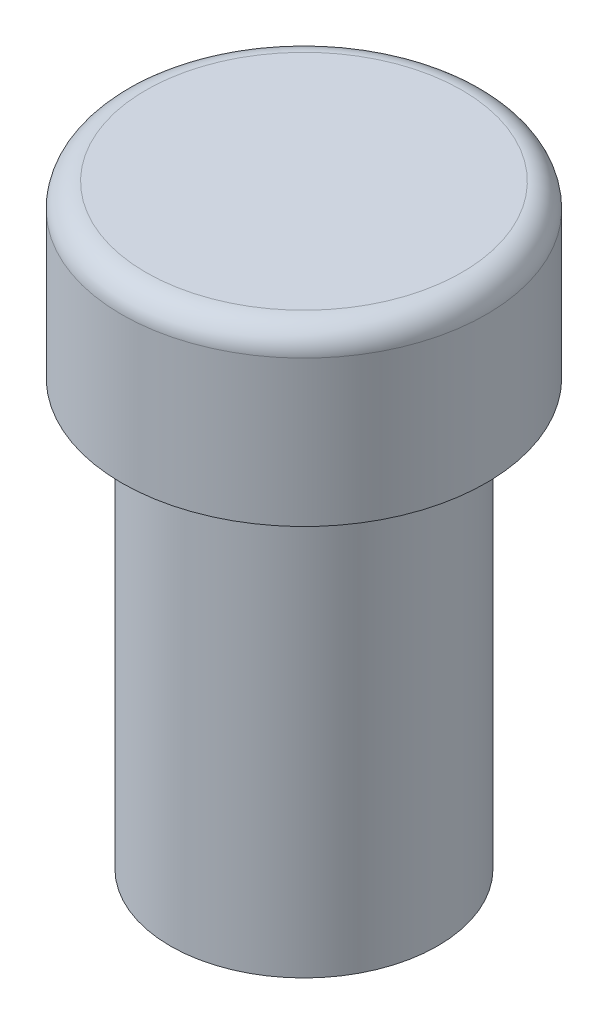
ISO-10303-21;
HEADER;
FILE_DESCRIPTION(('STEP AP214'),'2;1');
FILE_NAME('part.step','',(''),(''),'','','');
FILE_SCHEMA(('AUTOMOTIVE_DESIGN { 1 0 10303 214 1 1 1 1 }'));
ENDSEC;
DATA;
#1=APPLICATION_CONTEXT('core data for automotive mechanical design processes');
#2=APPLICATION_PROTOCOL_DEFINITION('international standard','automotive_design',2000,#1);
#3=PRODUCT_CONTEXT('',#1,'mechanical');
#4=PRODUCT('Part','Part','',(#3));
#5=PRODUCT_RELATED_PRODUCT_CATEGORY('part','',(#4));
#6=PRODUCT_DEFINITION_FORMATION('','',#4);
#7=PRODUCT_DEFINITION_CONTEXT('part definition',#1,'design');
#8=PRODUCT_DEFINITION('design','',#6,#7);
#9=PRODUCT_DEFINITION_SHAPE('','',#8);
#10=(LENGTH_UNIT() NAMED_UNIT(*) SI_UNIT(.MILLI.,.METRE.));
#11=(NAMED_UNIT(*) PLANE_ANGLE_UNIT() SI_UNIT($,.RADIAN.));
#12=(NAMED_UNIT(*) SI_UNIT($,.STERADIAN.) SOLID_ANGLE_UNIT());
#13=UNCERTAINTY_MEASURE_WITH_UNIT(LENGTH_MEASURE(1.E-05),#10,'distance_accuracy_value','');
#14=(GEOMETRIC_REPRESENTATION_CONTEXT(3) GLOBAL_UNCERTAINTY_ASSIGNED_CONTEXT((#13)) GLOBAL_UNIT_ASSIGNED_CONTEXT((#10,
#11,#12)) REPRESENTATION_CONTEXT('',''));
#15=CARTESIAN_POINT('',(0.,0.,0.));
#16=DIRECTION('',(0.,0.,1.));
#17=DIRECTION('',(1.,0.,0.));
#18=AXIS2_PLACEMENT_3D('',#15,#16,#17);
#19=CARTESIAN_POINT('',(0.,35.,0.));
#20=DIRECTION('',(0.,-1.,0.));
#21=DIRECTION('',(0.,0.,-1.));
#22=AXIS2_PLACEMENT_3D('',#19,#20,#21);
#23=CYLINDRICAL_SURFACE('',#22,11.);
#24=CARTESIAN_POINT('',(0.,35.,0.));
#25=DIRECTION('',(0.,1.,0.));
#26=DIRECTION('',(0.,0.,1.));
#27=AXIS2_PLACEMENT_3D('',#24,#25,#26);
#28=CIRCLE('',#27,11.);
#29=CARTESIAN_POINT('',(0.,35.,11.));
#30=VERTEX_POINT('',#29);
#31=EDGE_CURVE('E43',#30,#30,#28,.T.);
#32=ORIENTED_EDGE('',*,*,#31,.F.);
#33=EDGE_LOOP('',(#32));
#34=FACE_BOUND('',#33,.T.);
#35=CARTESIAN_POINT('',(0.,0.,0.));
#36=DIRECTION('',(0.,1.,0.));
#37=DIRECTION('',(0.,0.,1.));
#38=AXIS2_PLACEMENT_3D('',#35,#36,#37);
#39=CIRCLE('',#38,11.);
#40=CARTESIAN_POINT('',(0.,0.,11.));
#41=VERTEX_POINT('',#40);
#42=EDGE_CURVE('E47',#41,#41,#39,.T.);
#43=ORIENTED_EDGE('',*,*,#42,.T.);
#44=EDGE_LOOP('',(#43));
#45=FACE_BOUND('',#44,.T.);
#46=ADVANCED_FACE('F32',(#34,#45),#23,.T.);
#47=CARTESIAN_POINT('',(0.,0.,0.));
#48=DIRECTION('',(0.,1.,0.));
#49=DIRECTION('',(0.,0.,1.));
#50=AXIS2_PLACEMENT_3D('',#47,#48,#49);
#51=PLANE('',#50);
#52=ORIENTED_EDGE('',*,*,#42,.F.);
#53=EDGE_LOOP('',(#52));
#54=FACE_BOUND('',#53,.T.);
#55=ADVANCED_FACE('F61',(#54),#51,.F.);
#56=CARTESIAN_POINT('',(0.,35.,0.));
#57=DIRECTION('',(0.,1.,0.));
#58=DIRECTION('',(0.,0.,1.));
#59=AXIS2_PLACEMENT_3D('',#56,#57,#58);
#60=PLANE('',#59);
#61=CARTESIAN_POINT('',(0.,35.,0.));
#62=DIRECTION('',(0.,1.,0.));
#63=DIRECTION('',(0.,0.,1.));
#64=AXIS2_PLACEMENT_3D('',#61,#62,#63);
#65=CIRCLE('',#64,15.);
#66=CARTESIAN_POINT('',(0.,35.,15.));
#67=VERTEX_POINT('',#66);
#68=EDGE_CURVE('E51',#67,#67,#65,.T.);
#69=ORIENTED_EDGE('',*,*,#68,.F.);
#70=EDGE_LOOP('',(#69));
#71=FACE_BOUND('',#70,.T.);
#72=ORIENTED_EDGE('',*,*,#31,.T.);
#73=EDGE_LOOP('',(#72));
#74=FACE_BOUND('',#73,.T.);
#75=ADVANCED_FACE('F58',(#71,#74),#60,.F.);
#76=CARTESIAN_POINT('',(0.,49.,0.));
#77=DIRECTION('',(0.,-1.,0.));
#78=DIRECTION('',(0.,0.,-1.));
#79=AXIS2_PLACEMENT_3D('',#76,#77,#78);
#80=CYLINDRICAL_SURFACE('',#79,15.);
#81=CARTESIAN_POINT('',(0.,47.,0.));
#82=DIRECTION('',(0.,1.,0.));
#83=DIRECTION('',(0.,0.,1.));
#84=AXIS2_PLACEMENT_3D('',#81,#82,#83);
#85=CIRCLE('',#84,15.);
#86=CARTESIAN_POINT('',(0.,47.,15.));
#87=VERTEX_POINT('',#86);
#88=EDGE_CURVE('E10',#87,#87,#85,.F.);
#89=ORIENTED_EDGE('',*,*,#88,.T.);
#90=EDGE_LOOP('',(#89));
#91=FACE_BOUND('',#90,.T.);
#92=ORIENTED_EDGE('',*,*,#68,.T.);
#93=EDGE_LOOP('',(#92));
#94=FACE_BOUND('',#93,.T.);
#95=ADVANCED_FACE('F56',(#91,#94),#80,.T.);
#96=CARTESIAN_POINT('',(0.,49.,0.));
#97=DIRECTION('',(0.,1.,0.));
#98=DIRECTION('',(0.,0.,1.));
#99=AXIS2_PLACEMENT_3D('',#96,#97,#98);
#100=PLANE('',#99);
#101=CARTESIAN_POINT('',(0.,49.,0.));
#102=DIRECTION('',(0.,1.,0.));
#103=DIRECTION('',(0.,0.,1.));
#104=AXIS2_PLACEMENT_3D('',#101,#102,#103);
#105=CIRCLE('',#104,13.);
#106=CARTESIAN_POINT('',(0.,49.,13.));
#107=VERTEX_POINT('',#106);
#108=EDGE_CURVE('E39',#107,#107,#105,.T.);
#109=ORIENTED_EDGE('',*,*,#108,.T.);
#110=EDGE_LOOP('',(#109));
#111=FACE_BOUND('',#110,.T.);
#112=ADVANCED_FACE('F75',(#111),#100,.T.);
#113=CARTESIAN_POINT('',(0.,47.,0.));
#114=DIRECTION('',(0.,1.,0.));
#115=DIRECTION('',(0.,0.,1.));
#116=AXIS2_PLACEMENT_3D('',#113,#114,#115);
#117=TOROIDAL_SURFACE('',#116,13.,2.);
#118=ORIENTED_EDGE('',*,*,#88,.F.);
#119=EDGE_LOOP('',(#118));
#120=FACE_BOUND('',#119,.T.);
#121=ORIENTED_EDGE('',*,*,#108,.F.);
#122=EDGE_LOOP('',(#121));
#123=FACE_BOUND('',#122,.T.);
#124=ADVANCED_FACE('F34',(#120,#123),#117,.T.);
#125=CLOSED_SHELL('',(#46,#55,#75,#95,#112,#124));
#126=MANIFOLD_SOLID_BREP('B2',#125);
#127=ADVANCED_BREP_SHAPE_REPRESENTATION('',(#18,#126),#14);
#128=SHAPE_DEFINITION_REPRESENTATION(#9,#127);
ENDSEC;
END-ISO-10303-21;
